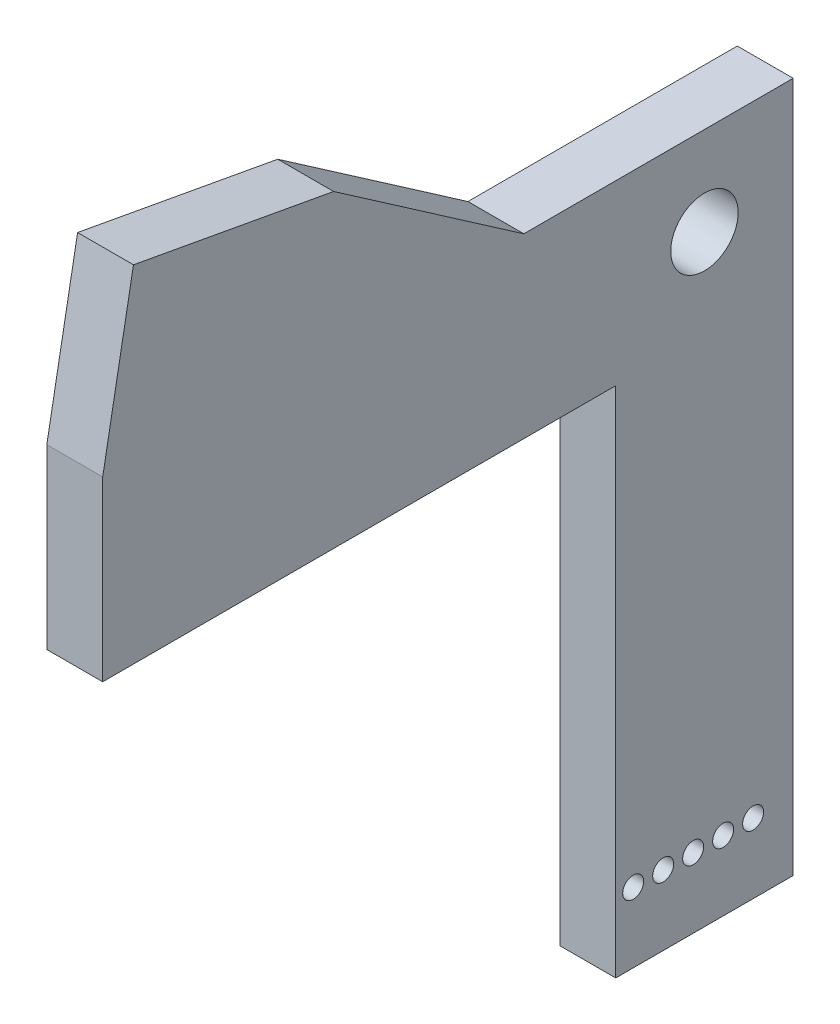
ISO-10303-21;
HEADER;
FILE_DESCRIPTION(('STEP AP214'),'2;1');
FILE_NAME('part.step','',(''),(''),'','','');
FILE_SCHEMA(('AUTOMOTIVE_DESIGN { 1 0 10303 214 1 1 1 1 }'));
ENDSEC;
DATA;
#1=APPLICATION_CONTEXT('core data for automotive mechanical design processes');
#2=APPLICATION_PROTOCOL_DEFINITION('international standard','automotive_design',2000,#1);
#3=PRODUCT_CONTEXT('',#1,'mechanical');
#4=PRODUCT('Part','Part','',(#3));
#5=PRODUCT_RELATED_PRODUCT_CATEGORY('part','',(#4));
#6=PRODUCT_DEFINITION_FORMATION('','',#4);
#7=PRODUCT_DEFINITION_CONTEXT('part definition',#1,'design');
#8=PRODUCT_DEFINITION('design','',#6,#7);
#9=PRODUCT_DEFINITION_SHAPE('','',#8);
#10=(LENGTH_UNIT() NAMED_UNIT(*) SI_UNIT(.MILLI.,.METRE.));
#11=(NAMED_UNIT(*) PLANE_ANGLE_UNIT() SI_UNIT($,.RADIAN.));
#12=(NAMED_UNIT(*) SI_UNIT($,.STERADIAN.) SOLID_ANGLE_UNIT());
#13=UNCERTAINTY_MEASURE_WITH_UNIT(LENGTH_MEASURE(1.E-05),#10,'distance_accuracy_value','');
#14=(GEOMETRIC_REPRESENTATION_CONTEXT(3) GLOBAL_UNCERTAINTY_ASSIGNED_CONTEXT((#13)) GLOBAL_UNIT_ASSIGNED_CONTEXT((#10,
#11,#12)) REPRESENTATION_CONTEXT('',''));
#15=CARTESIAN_POINT('',(0.,0.,0.));
#16=DIRECTION('',(0.,0.,1.));
#17=DIRECTION('',(1.,0.,0.));
#18=AXIS2_PLACEMENT_3D('',#15,#16,#17);
#19=CARTESIAN_POINT('',(2.,-1.76006289421213,1.21908976642615));
#20=DIRECTION('',(0.,0.822064366447403,-0.569394570941303));
#21=DIRECTION('',(0.,0.569394570941303,0.822064366447403));
#22=AXIS2_PLACEMENT_3D('',#19,#20,#21);
#23=PLANE('',#22);
#24=DIRECTION('',(0.,-0.569394570941303,-0.822064366447403));
#25=VECTOR('',#24,1.);
#26=CARTESIAN_POINT('',(-2.,-1.76006289421213,1.21908976642615));
#27=LINE('',#26,#25);
#28=CARTESIAN_POINT('',(-2.,15.777631528535,26.5391654930877));
#29=VERTEX_POINT('',#28);
#30=CARTESIAN_POINT('',(-2.,6.35,12.9280066673327));
#31=VERTEX_POINT('',#30);
#32=EDGE_CURVE('E154',#29,#31,#27,.T.);
#33=ORIENTED_EDGE('',*,*,#32,.F.);
#34=DIRECTION('',(-1.,0.,0.));
#35=VECTOR('',#34,1.);
#36=CARTESIAN_POINT('',(2.,15.777631528535,26.5391654930877));
#37=LINE('',#36,#35);
#38=CARTESIAN_POINT('',(2.,15.777631528535,26.5391654930877));
#39=VERTEX_POINT('',#38);
#40=EDGE_CURVE('E11',#39,#29,#37,.T.);
#41=ORIENTED_EDGE('',*,*,#40,.F.);
#42=DIRECTION('',(0.,-0.569394570941303,-0.822064366447403));
#43=VECTOR('',#42,1.);
#44=CARTESIAN_POINT('',(2.,-1.76006289421213,1.21908976642615));
#45=LINE('',#44,#43);
#46=CARTESIAN_POINT('',(2.,6.35,12.9280066673327));
#47=VERTEX_POINT('',#46);
#48=EDGE_CURVE('E227',#39,#47,#45,.T.);
#49=ORIENTED_EDGE('',*,*,#48,.T.);
#50=DIRECTION('',(-1.,0.,0.));
#51=VECTOR('',#50,1.);
#52=CARTESIAN_POINT('',(2.,6.35,12.9280066673327));
#53=LINE('',#52,#51);
#54=EDGE_CURVE('E52',#47,#31,#53,.T.);
#55=ORIENTED_EDGE('',*,*,#54,.T.);
#56=EDGE_LOOP('',(#33,#41,#49,#55));
#57=FACE_BOUND('',#56,.T.);
#58=ADVANCED_FACE('F35',(#57),#23,.T.);
#59=CARTESIAN_POINT('',(2.,10.5738669342309,-1.93257962085005));
#60=DIRECTION('',(0.,0.983704801782163,-0.179791164829409));
#61=DIRECTION('',(0.,0.179791164829409,0.983704801782163));
#62=AXIS2_PLACEMENT_3D('',#59,#60,#61);
#63=PLANE('',#62);
#64=DIRECTION('',(0.,-0.179791164829409,-0.983704801782163));
#65=VECTOR('',#64,1.);
#66=CARTESIAN_POINT('',(-2.,10.5738669342309,-1.93257962085005));
#67=LINE('',#66,#65);
#68=CARTESIAN_POINT('',(-2.,18.3958705630506,40.8645318864268));
#69=VERTEX_POINT('',#68);
#70=EDGE_CURVE('E156',#69,#29,#67,.T.);
#71=ORIENTED_EDGE('',*,*,#70,.F.);
#72=DIRECTION('',(-1.,0.,0.));
#73=VECTOR('',#72,1.);
#74=CARTESIAN_POINT('',(2.,18.3958705630506,40.8645318864268));
#75=LINE('',#74,#73);
#76=CARTESIAN_POINT('',(2.,18.3958705630506,40.8645318864268));
#77=VERTEX_POINT('',#76);
#78=EDGE_CURVE('E44',#77,#69,#75,.T.);
#79=ORIENTED_EDGE('',*,*,#78,.F.);
#80=DIRECTION('',(0.,-0.179791164829409,-0.983704801782163));
#81=VECTOR('',#80,1.);
#82=CARTESIAN_POINT('',(2.,10.5738669342309,-1.93257962085005));
#83=LINE('',#82,#81);
#84=EDGE_CURVE('E223',#77,#39,#83,.T.);
#85=ORIENTED_EDGE('',*,*,#84,.T.);
#86=ORIENTED_EDGE('',*,*,#40,.T.);
#87=EDGE_LOOP('',(#71,#79,#85,#86));
#88=FACE_BOUND('',#87,.T.);
#89=ADVANCED_FACE('F211',(#88),#63,.T.);
#90=CARTESIAN_POINT('',(2.,7.82200362881963,42.7971115072768));
#91=DIRECTION('',(0.,0.179791164829408,0.983704801782163));
#92=DIRECTION('',(0.,-0.983704801782163,0.179791164829408));
#93=AXIS2_PLACEMENT_3D('',#90,#91,#92);
#94=PLANE('',#93);
#95=DIRECTION('',(0.,0.983704801782163,-0.179791164829408));
#96=VECTOR('',#95,1.);
#97=CARTESIAN_POINT('',(-2.,7.82200362881963,42.7971115072768));
#98=LINE('',#97,#96);
#99=CARTESIAN_POINT('',(-2.,6.35,43.0661487698572));
#100=VERTEX_POINT('',#99);
#101=EDGE_CURVE('E159',#100,#69,#98,.T.);
#102=ORIENTED_EDGE('',*,*,#101,.F.);
#103=DIRECTION('',(-1.,0.,0.));
#104=VECTOR('',#103,1.);
#105=CARTESIAN_POINT('',(2.,6.35,43.0661487698572));
#106=LINE('',#105,#104);
#107=CARTESIAN_POINT('',(2.,6.35,43.0661487698572));
#108=VERTEX_POINT('',#107);
#109=EDGE_CURVE('E200',#108,#100,#106,.T.);
#110=ORIENTED_EDGE('',*,*,#109,.F.);
#111=DIRECTION('',(0.,0.983704801782163,-0.179791164829408));
#112=VECTOR('',#111,1.);
#113=CARTESIAN_POINT('',(2.,7.82200362881963,42.7971115072768));
#114=LINE('',#113,#112);
#115=EDGE_CURVE('E207',#108,#77,#114,.T.);
#116=ORIENTED_EDGE('',*,*,#115,.T.);
#117=ORIENTED_EDGE('',*,*,#78,.T.);
#118=EDGE_LOOP('',(#102,#110,#116,#117));
#119=FACE_BOUND('',#118,.T.);
#120=ADVANCED_FACE('F205',(#119),#94,.T.);
#121=CARTESIAN_POINT('',(2.,0.,43.0661487698572));
#122=DIRECTION('',(0.,0.,1.));
#123=DIRECTION('',(1.,0.,0.));
#124=AXIS2_PLACEMENT_3D('',#121,#122,#123);
#125=PLANE('',#124);
#126=DIRECTION('',(0.,1.,0.));
#127=VECTOR('',#126,1.);
#128=CARTESIAN_POINT('',(-2.,0.,43.0661487698572));
#129=LINE('',#128,#127);
#130=CARTESIAN_POINT('',(-2.,-6.35,43.0661487698572));
#131=VERTEX_POINT('',#130);
#132=EDGE_CURVE('E162',#131,#100,#129,.T.);
#133=ORIENTED_EDGE('',*,*,#132,.F.);
#134=DIRECTION('',(-1.,0.,0.));
#135=VECTOR('',#134,1.);
#136=CARTESIAN_POINT('',(2.,-6.35,43.0661487698572));
#137=LINE('',#136,#135);
#138=CARTESIAN_POINT('',(2.,-6.35,43.0661487698572));
#139=VERTEX_POINT('',#138);
#140=EDGE_CURVE('E198',#139,#131,#137,.T.);
#141=ORIENTED_EDGE('',*,*,#140,.F.);
#142=DIRECTION('',(0.,1.,0.));
#143=VECTOR('',#142,1.);
#144=CARTESIAN_POINT('',(2.,0.,43.0661487698572));
#145=LINE('',#144,#143);
#146=EDGE_CURVE('E221',#139,#108,#145,.T.);
#147=ORIENTED_EDGE('',*,*,#146,.T.);
#148=ORIENTED_EDGE('',*,*,#109,.T.);
#149=EDGE_LOOP('',(#133,#141,#147,#148));
#150=FACE_BOUND('',#149,.T.);
#151=ADVANCED_FACE('F218',(#150),#125,.T.);
#152=CARTESIAN_POINT('',(2.,-6.35,0.));
#153=DIRECTION('',(0.,-1.,0.));
#154=DIRECTION('',(0.,0.,-1.));
#155=AXIS2_PLACEMENT_3D('',#152,#153,#154);
#156=PLANE('',#155);
#157=DIRECTION('',(0.,0.,1.));
#158=VECTOR('',#157,1.);
#159=CARTESIAN_POINT('',(-2.,-6.35,0.));
#160=LINE('',#159,#158);
#161=CARTESIAN_POINT('',(-2.,-6.35,6.35));
#162=VERTEX_POINT('',#161);
#163=EDGE_CURVE('E165',#162,#131,#160,.T.);
#164=ORIENTED_EDGE('',*,*,#163,.F.);
#165=DIRECTION('',(-1.,0.,0.));
#166=VECTOR('',#165,1.);
#167=CARTESIAN_POINT('',(2.,-6.35,6.35));
#168=LINE('',#167,#166);
#169=CARTESIAN_POINT('',(2.,-6.35,6.35));
#170=VERTEX_POINT('',#169);
#171=EDGE_CURVE('E196',#170,#162,#168,.T.);
#172=ORIENTED_EDGE('',*,*,#171,.F.);
#173=DIRECTION('',(0.,0.,1.));
#174=VECTOR('',#173,1.);
#175=CARTESIAN_POINT('',(2.,-6.35,0.));
#176=LINE('',#175,#174);
#177=EDGE_CURVE('E225',#170,#139,#176,.T.);
#178=ORIENTED_EDGE('',*,*,#177,.T.);
#179=ORIENTED_EDGE('',*,*,#140,.T.);
#180=EDGE_LOOP('',(#164,#172,#178,#179));
#181=FACE_BOUND('',#180,.T.);
#182=ADVANCED_FACE('F258',(#181),#156,.T.);
#183=CARTESIAN_POINT('',(2.,0.,6.35));
#184=DIRECTION('',(0.,0.,1.));
#185=DIRECTION('',(1.,0.,0.));
#186=AXIS2_PLACEMENT_3D('',#183,#184,#185);
#187=PLANE('',#186);
#188=DIRECTION('',(0.,1.,0.));
#189=VECTOR('',#188,1.);
#190=CARTESIAN_POINT('',(-2.,0.,6.35));
#191=LINE('',#190,#189);
#192=CARTESIAN_POINT('',(-2.,-43.0661487698572,6.35));
#193=VERTEX_POINT('',#192);
#194=EDGE_CURVE('E168',#193,#162,#191,.T.);
#195=ORIENTED_EDGE('',*,*,#194,.F.);
#196=DIRECTION('',(-1.,0.,0.));
#197=VECTOR('',#196,1.);
#198=CARTESIAN_POINT('',(2.,-43.0661487698572,6.35));
#199=LINE('',#198,#197);
#200=CARTESIAN_POINT('',(2.,-43.0661487698572,6.35));
#201=VERTEX_POINT('',#200);
#202=EDGE_CURVE('E117',#201,#193,#199,.T.);
#203=ORIENTED_EDGE('',*,*,#202,.F.);
#204=DIRECTION('',(0.,1.,0.));
#205=VECTOR('',#204,1.);
#206=CARTESIAN_POINT('',(2.,0.,6.35));
#207=LINE('',#206,#205);
#208=EDGE_CURVE('E128',#201,#170,#207,.T.);
#209=ORIENTED_EDGE('',*,*,#208,.T.);
#210=ORIENTED_EDGE('',*,*,#171,.T.);
#211=EDGE_LOOP('',(#195,#203,#209,#210));
#212=FACE_BOUND('',#211,.T.);
#213=ADVANCED_FACE('F233',(#212),#187,.T.);
#214=CARTESIAN_POINT('',(2.,-43.0661487698572,0.));
#215=DIRECTION('',(0.,-1.,0.));
#216=DIRECTION('',(0.,0.,-1.));
#217=AXIS2_PLACEMENT_3D('',#214,#215,#216);
#218=PLANE('',#217);
#219=DIRECTION('',(0.,0.,1.));
#220=VECTOR('',#219,1.);
#221=CARTESIAN_POINT('',(-2.,-43.0661487698572,0.));
#222=LINE('',#221,#220);
#223=CARTESIAN_POINT('',(-2.,-43.0661487698572,-6.35));
#224=VERTEX_POINT('',#223);
#225=EDGE_CURVE('E113',#224,#193,#222,.T.);
#226=ORIENTED_EDGE('',*,*,#225,.F.);
#227=DIRECTION('',(-1.,0.,0.));
#228=VECTOR('',#227,1.);
#229=CARTESIAN_POINT('',(2.,-43.0661487698572,-6.35));
#230=LINE('',#229,#228);
#231=CARTESIAN_POINT('',(2.,-43.0661487698572,-6.35));
#232=VERTEX_POINT('',#231);
#233=EDGE_CURVE('E108',#232,#224,#230,.T.);
#234=ORIENTED_EDGE('',*,*,#233,.F.);
#235=DIRECTION('',(0.,0.,1.));
#236=VECTOR('',#235,1.);
#237=CARTESIAN_POINT('',(2.,-43.0661487698572,0.));
#238=LINE('',#237,#236);
#239=EDGE_CURVE('E111',#232,#201,#238,.T.);
#240=ORIENTED_EDGE('',*,*,#239,.T.);
#241=ORIENTED_EDGE('',*,*,#202,.T.);
#242=EDGE_LOOP('',(#226,#234,#240,#241));
#243=FACE_BOUND('',#242,.T.);
#244=ADVANCED_FACE('F110',(#243),#218,.T.);
#245=CARTESIAN_POINT('',(2.,0.,-6.35));
#246=DIRECTION('',(0.,0.,-1.));
#247=DIRECTION('',(0.,1.,0.));
#248=AXIS2_PLACEMENT_3D('',#245,#246,#247);
#249=PLANE('',#248);
#250=DIRECTION('',(0.,-1.,0.));
#251=VECTOR('',#250,1.);
#252=CARTESIAN_POINT('',(-2.,0.,-6.35));
#253=LINE('',#252,#251);
#254=CARTESIAN_POINT('',(-2.,6.35,-6.35));
#255=VERTEX_POINT('',#254);
#256=EDGE_CURVE('E172',#255,#224,#253,.T.);
#257=ORIENTED_EDGE('',*,*,#256,.F.);
#258=DIRECTION('',(-1.,0.,0.));
#259=VECTOR('',#258,1.);
#260=CARTESIAN_POINT('',(2.,6.35,-6.35));
#261=LINE('',#260,#259);
#262=CARTESIAN_POINT('',(2.,6.35,-6.35));
#263=VERTEX_POINT('',#262);
#264=EDGE_CURVE('E80',#263,#255,#261,.T.);
#265=ORIENTED_EDGE('',*,*,#264,.F.);
#266=DIRECTION('',(0.,-1.,0.));
#267=VECTOR('',#266,1.);
#268=CARTESIAN_POINT('',(2.,0.,-6.35));
#269=LINE('',#268,#267);
#270=EDGE_CURVE('E125',#263,#232,#269,.T.);
#271=ORIENTED_EDGE('',*,*,#270,.T.);
#272=ORIENTED_EDGE('',*,*,#233,.T.);
#273=EDGE_LOOP('',(#257,#265,#271,#272));
#274=FACE_BOUND('',#273,.T.);
#275=ADVANCED_FACE('F130',(#274),#249,.T.);
#276=CARTESIAN_POINT('',(2.,-38.0661487698572,2.95454545454545));
#277=DIRECTION('',(-1.,0.,0.));
#278=DIRECTION('',(0.,0.,1.));
#279=AXIS2_PLACEMENT_3D('',#276,#277,#278);
#280=CYLINDRICAL_SURFACE('',#279,0.750000000000001);
#281=CARTESIAN_POINT('',(2.,-38.0661487698572,2.95454545454545));
#282=DIRECTION('',(1.,0.,0.));
#283=DIRECTION('',(0.,0.,-1.));
#284=AXIS2_PLACEMENT_3D('',#281,#282,#283);
#285=CIRCLE('',#284,0.750000000000001);
#286=CARTESIAN_POINT('',(2.,-38.0661487698572,2.20454545454545));
#287=VERTEX_POINT('',#286);
#288=EDGE_CURVE('E145',#287,#287,#285,.T.);
#289=ORIENTED_EDGE('',*,*,#288,.T.);
#290=EDGE_LOOP('',(#289));
#291=FACE_BOUND('',#290,.T.);
#292=CARTESIAN_POINT('',(-2.,-38.0661487698572,2.95454545454545));
#293=DIRECTION('',(1.,0.,0.));
#294=DIRECTION('',(0.,0.,-1.));
#295=AXIS2_PLACEMENT_3D('',#292,#293,#294);
#296=CIRCLE('',#295,0.750000000000001);
#297=CARTESIAN_POINT('',(-2.,-38.0661487698572,2.20454545454545));
#298=VERTEX_POINT('',#297);
#299=EDGE_CURVE('E186',#298,#298,#296,.T.);
#300=ORIENTED_EDGE('',*,*,#299,.F.);
#301=EDGE_LOOP('',(#300));
#302=FACE_BOUND('',#301,.T.);
#303=ADVANCED_FACE('F266',(#291,#302),#280,.F.);
#304=CARTESIAN_POINT('',(2.,-38.0661487698572,0.809090909090904));
#305=DIRECTION('',(-1.,0.,0.));
#306=DIRECTION('',(0.,0.,1.));
#307=AXIS2_PLACEMENT_3D('',#304,#305,#306);
#308=CYLINDRICAL_SURFACE('',#307,0.750000000000001);
#309=CARTESIAN_POINT('',(2.,-38.0661487698572,0.809090909090904));
#310=DIRECTION('',(1.,0.,0.));
#311=DIRECTION('',(0.,0.,-1.));
#312=AXIS2_PLACEMENT_3D('',#309,#310,#311);
#313=CIRCLE('',#312,0.750000000000001);
#314=CARTESIAN_POINT('',(2.,-38.0661487698572,0.0590909090909031));
#315=VERTEX_POINT('',#314);
#316=EDGE_CURVE('E142',#315,#315,#313,.T.);
#317=ORIENTED_EDGE('',*,*,#316,.T.);
#318=EDGE_LOOP('',(#317));
#319=FACE_BOUND('',#318,.T.);
#320=CARTESIAN_POINT('',(-2.,-38.0661487698572,0.809090909090904));
#321=DIRECTION('',(1.,0.,0.));
#322=DIRECTION('',(0.,0.,-1.));
#323=AXIS2_PLACEMENT_3D('',#320,#321,#322);
#324=CIRCLE('',#323,0.750000000000001);
#325=CARTESIAN_POINT('',(-2.,-38.0661487698572,0.0590909090909031));
#326=VERTEX_POINT('',#325);
#327=EDGE_CURVE('E183',#326,#326,#324,.T.);
#328=ORIENTED_EDGE('',*,*,#327,.F.);
#329=EDGE_LOOP('',(#328));
#330=FACE_BOUND('',#329,.T.);
#331=ADVANCED_FACE('F270',(#319,#330),#308,.F.);
#332=CARTESIAN_POINT('',(2.,-38.0661487698572,-1.33636363636364));
#333=DIRECTION('',(-1.,0.,0.));
#334=DIRECTION('',(0.,0.,1.));
#335=AXIS2_PLACEMENT_3D('',#332,#333,#334);
#336=CYLINDRICAL_SURFACE('',#335,0.750000000000001);
#337=CARTESIAN_POINT('',(2.,-38.0661487698572,-1.33636363636364));
#338=DIRECTION('',(1.,0.,0.));
#339=DIRECTION('',(0.,0.,-1.));
#340=AXIS2_PLACEMENT_3D('',#337,#338,#339);
#341=CIRCLE('',#340,0.750000000000001);
#342=CARTESIAN_POINT('',(2.,-38.0661487698572,-2.08636363636364));
#343=VERTEX_POINT('',#342);
#344=EDGE_CURVE('E139',#343,#343,#341,.T.);
#345=ORIENTED_EDGE('',*,*,#344,.T.);
#346=EDGE_LOOP('',(#345));
#347=FACE_BOUND('',#346,.T.);
#348=CARTESIAN_POINT('',(-2.,-38.0661487698572,-1.33636363636364));
#349=DIRECTION('',(1.,0.,0.));
#350=DIRECTION('',(0.,0.,-1.));
#351=AXIS2_PLACEMENT_3D('',#348,#349,#350);
#352=CIRCLE('',#351,0.750000000000001);
#353=CARTESIAN_POINT('',(-2.,-38.0661487698572,-2.08636363636364));
#354=VERTEX_POINT('',#353);
#355=EDGE_CURVE('E180',#354,#354,#352,.T.);
#356=ORIENTED_EDGE('',*,*,#355,.F.);
#357=EDGE_LOOP('',(#356));
#358=FACE_BOUND('',#357,.T.);
#359=ADVANCED_FACE('F244',(#347,#358),#336,.F.);
#360=CARTESIAN_POINT('',(2.,-38.0661487698572,-3.48181818181819));
#361=DIRECTION('',(-1.,0.,0.));
#362=DIRECTION('',(0.,0.,1.));
#363=AXIS2_PLACEMENT_3D('',#360,#361,#362);
#364=CYLINDRICAL_SURFACE('',#363,0.750000000000001);
#365=CARTESIAN_POINT('',(2.,-38.0661487698572,-3.48181818181819));
#366=DIRECTION('',(1.,0.,0.));
#367=DIRECTION('',(0.,0.,-1.));
#368=AXIS2_PLACEMENT_3D('',#365,#366,#367);
#369=CIRCLE('',#368,0.750000000000001);
#370=CARTESIAN_POINT('',(2.,-38.0661487698572,-4.23181818181819));
#371=VERTEX_POINT('',#370);
#372=EDGE_CURVE('E133',#371,#371,#369,.T.);
#373=ORIENTED_EDGE('',*,*,#372,.T.);
#374=EDGE_LOOP('',(#373));
#375=FACE_BOUND('',#374,.T.);
#376=CARTESIAN_POINT('',(-2.,-38.0661487698572,-3.48181818181819));
#377=DIRECTION('',(1.,0.,0.));
#378=DIRECTION('',(0.,0.,-1.));
#379=AXIS2_PLACEMENT_3D('',#376,#377,#378);
#380=CIRCLE('',#379,0.750000000000001);
#381=CARTESIAN_POINT('',(-2.,-38.0661487698572,-4.23181818181819));
#382=VERTEX_POINT('',#381);
#383=EDGE_CURVE('E177',#382,#382,#380,.T.);
#384=ORIENTED_EDGE('',*,*,#383,.F.);
#385=EDGE_LOOP('',(#384));
#386=FACE_BOUND('',#385,.T.);
#387=ADVANCED_FACE('F236',(#375,#386),#364,.F.);
#388=CARTESIAN_POINT('',(2.,6.35,0.));
#389=DIRECTION('',(0.,1.,0.));
#390=DIRECTION('',(0.,0.,1.));
#391=AXIS2_PLACEMENT_3D('',#388,#389,#390);
#392=PLANE('',#391);
#393=DIRECTION('',(0.,0.,-1.));
#394=VECTOR('',#393,1.);
#395=CARTESIAN_POINT('',(-2.,6.35,0.));
#396=LINE('',#395,#394);
#397=EDGE_CURVE('E174',#31,#255,#396,.T.);
#398=ORIENTED_EDGE('',*,*,#397,.F.);
#399=ORIENTED_EDGE('',*,*,#54,.F.);
#400=DIRECTION('',(0.,0.,-1.));
#401=VECTOR('',#400,1.);
#402=CARTESIAN_POINT('',(2.,6.35,0.));
#403=LINE('',#402,#401);
#404=EDGE_CURVE('E131',#47,#263,#403,.T.);
#405=ORIENTED_EDGE('',*,*,#404,.T.);
#406=ORIENTED_EDGE('',*,*,#264,.T.);
#407=EDGE_LOOP('',(#398,#399,#405,#406));
#408=FACE_BOUND('',#407,.T.);
#409=ADVANCED_FACE('F234',(#408),#392,.T.);
#410=CARTESIAN_POINT('',(2.,0.,0.));
#411=DIRECTION('',(-1.,0.,0.));
#412=DIRECTION('',(0.,0.,1.));
#413=AXIS2_PLACEMENT_3D('',#410,#411,#412);
#414=CYLINDRICAL_SURFACE('',#413,2.413);
#415=CARTESIAN_POINT('',(2.,0.,0.));
#416=DIRECTION('',(1.,0.,0.));
#417=DIRECTION('',(0.,0.,-1.));
#418=AXIS2_PLACEMENT_3D('',#415,#416,#417);
#419=CIRCLE('',#418,2.413);
#420=CARTESIAN_POINT('',(2.,0.,-2.413));
#421=VERTEX_POINT('',#420);
#422=EDGE_CURVE('E192',#421,#421,#419,.T.);
#423=ORIENTED_EDGE('',*,*,#422,.T.);
#424=EDGE_LOOP('',(#423));
#425=FACE_BOUND('',#424,.T.);
#426=CARTESIAN_POINT('',(-2.,0.,0.));
#427=DIRECTION('',(1.,0.,0.));
#428=DIRECTION('',(0.,0.,-1.));
#429=AXIS2_PLACEMENT_3D('',#426,#427,#428);
#430=CIRCLE('',#429,2.413);
#431=CARTESIAN_POINT('',(-2.,0.,-2.413));
#432=VERTEX_POINT('',#431);
#433=EDGE_CURVE('E151',#432,#432,#430,.T.);
#434=ORIENTED_EDGE('',*,*,#433,.F.);
#435=EDGE_LOOP('',(#434));
#436=FACE_BOUND('',#435,.T.);
#437=ADVANCED_FACE('F37',(#425,#436),#414,.F.);
#438=CARTESIAN_POINT('',(2.,-38.0661487698572,5.1));
#439=DIRECTION('',(-1.,0.,0.));
#440=DIRECTION('',(0.,0.,1.));
#441=AXIS2_PLACEMENT_3D('',#438,#439,#440);
#442=CYLINDRICAL_SURFACE('',#441,0.750000000000001);
#443=CARTESIAN_POINT('',(2.,-38.0661487698572,5.1));
#444=DIRECTION('',(1.,0.,0.));
#445=DIRECTION('',(0.,0.,-1.));
#446=AXIS2_PLACEMENT_3D('',#443,#444,#445);
#447=CIRCLE('',#446,0.750000000000001);
#448=CARTESIAN_POINT('',(2.,-38.0661487698572,4.34999999999999));
#449=VERTEX_POINT('',#448);
#450=EDGE_CURVE('E148',#449,#449,#447,.T.);
#451=ORIENTED_EDGE('',*,*,#450,.T.);
#452=EDGE_LOOP('',(#451));
#453=FACE_BOUND('',#452,.T.);
#454=CARTESIAN_POINT('',(-2.,-38.0661487698572,5.1));
#455=DIRECTION('',(1.,0.,0.));
#456=DIRECTION('',(0.,0.,-1.));
#457=AXIS2_PLACEMENT_3D('',#454,#455,#456);
#458=CIRCLE('',#457,0.750000000000001);
#459=CARTESIAN_POINT('',(-2.,-38.0661487698572,4.34999999999999));
#460=VERTEX_POINT('',#459);
#461=EDGE_CURVE('E189',#460,#460,#458,.T.);
#462=ORIENTED_EDGE('',*,*,#461,.F.);
#463=EDGE_LOOP('',(#462));
#464=FACE_BOUND('',#463,.T.);
#465=ADVANCED_FACE('F242',(#453,#464),#442,.F.);
#466=CARTESIAN_POINT('',(2.,0.,0.));
#467=DIRECTION('',(1.,0.,0.));
#468=DIRECTION('',(0.,0.,-1.));
#469=AXIS2_PLACEMENT_3D('',#466,#467,#468);
#470=PLANE('',#469);
#471=ORIENTED_EDGE('',*,*,#422,.F.);
#472=EDGE_LOOP('',(#471));
#473=FACE_BOUND('',#472,.T.);
#474=ORIENTED_EDGE('',*,*,#48,.F.);
#475=ORIENTED_EDGE('',*,*,#84,.F.);
#476=ORIENTED_EDGE('',*,*,#115,.F.);
#477=ORIENTED_EDGE('',*,*,#146,.F.);
#478=ORIENTED_EDGE('',*,*,#177,.F.);
#479=ORIENTED_EDGE('',*,*,#208,.F.);
#480=ORIENTED_EDGE('',*,*,#239,.F.);
#481=ORIENTED_EDGE('',*,*,#270,.F.);
#482=ORIENTED_EDGE('',*,*,#404,.F.);
#483=EDGE_LOOP('',(#474,#475,#476,#477,#478,#479,#480,#481,#482));
#484=FACE_BOUND('',#483,.T.);
#485=ORIENTED_EDGE('',*,*,#372,.F.);
#486=EDGE_LOOP('',(#485));
#487=FACE_BOUND('',#486,.T.);
#488=ORIENTED_EDGE('',*,*,#344,.F.);
#489=EDGE_LOOP('',(#488));
#490=FACE_BOUND('',#489,.T.);
#491=ORIENTED_EDGE('',*,*,#316,.F.);
#492=EDGE_LOOP('',(#491));
#493=FACE_BOUND('',#492,.T.);
#494=ORIENTED_EDGE('',*,*,#288,.F.);
#495=EDGE_LOOP('',(#494));
#496=FACE_BOUND('',#495,.T.);
#497=ORIENTED_EDGE('',*,*,#450,.F.);
#498=EDGE_LOOP('',(#497));
#499=FACE_BOUND('',#498,.T.);
#500=ADVANCED_FACE('F122',(#473,#484,#487,#490,#493,#496,#499),#470,.T.);
#501=CARTESIAN_POINT('',(-2.,0.,0.));
#502=DIRECTION('',(1.,0.,0.));
#503=DIRECTION('',(0.,0.,-1.));
#504=AXIS2_PLACEMENT_3D('',#501,#502,#503);
#505=PLANE('',#504);
#506=ORIENTED_EDGE('',*,*,#433,.T.);
#507=EDGE_LOOP('',(#506));
#508=FACE_BOUND('',#507,.T.);
#509=ORIENTED_EDGE('',*,*,#32,.T.);
#510=ORIENTED_EDGE('',*,*,#397,.T.);
#511=ORIENTED_EDGE('',*,*,#256,.T.);
#512=ORIENTED_EDGE('',*,*,#225,.T.);
#513=ORIENTED_EDGE('',*,*,#194,.T.);
#514=ORIENTED_EDGE('',*,*,#163,.T.);
#515=ORIENTED_EDGE('',*,*,#132,.T.);
#516=ORIENTED_EDGE('',*,*,#101,.T.);
#517=ORIENTED_EDGE('',*,*,#70,.T.);
#518=EDGE_LOOP('',(#509,#510,#511,#512,#513,#514,#515,#516,#517));
#519=FACE_BOUND('',#518,.T.);
#520=ORIENTED_EDGE('',*,*,#383,.T.);
#521=EDGE_LOOP('',(#520));
#522=FACE_BOUND('',#521,.T.);
#523=ORIENTED_EDGE('',*,*,#355,.T.);
#524=EDGE_LOOP('',(#523));
#525=FACE_BOUND('',#524,.T.);
#526=ORIENTED_EDGE('',*,*,#327,.T.);
#527=EDGE_LOOP('',(#526));
#528=FACE_BOUND('',#527,.T.);
#529=ORIENTED_EDGE('',*,*,#299,.T.);
#530=EDGE_LOOP('',(#529));
#531=FACE_BOUND('',#530,.T.);
#532=ORIENTED_EDGE('',*,*,#461,.T.);
#533=EDGE_LOOP('',(#532));
#534=FACE_BOUND('',#533,.T.);
#535=ADVANCED_FACE('F213',(#508,#519,#522,#525,#528,#531,#534),#505,.F.);
#536=CLOSED_SHELL('',(#58,#89,#120,#151,#182,#213,#244,#275,#303,#331,#359,#387,#409,#437,#465,
#500,#535));
#537=MANIFOLD_SOLID_BREP('B2',#536);
#538=ADVANCED_BREP_SHAPE_REPRESENTATION('',(#18,#537),#14);
#539=SHAPE_DEFINITION_REPRESENTATION(#9,#538);
ENDSEC;
END-ISO-10303-21;
